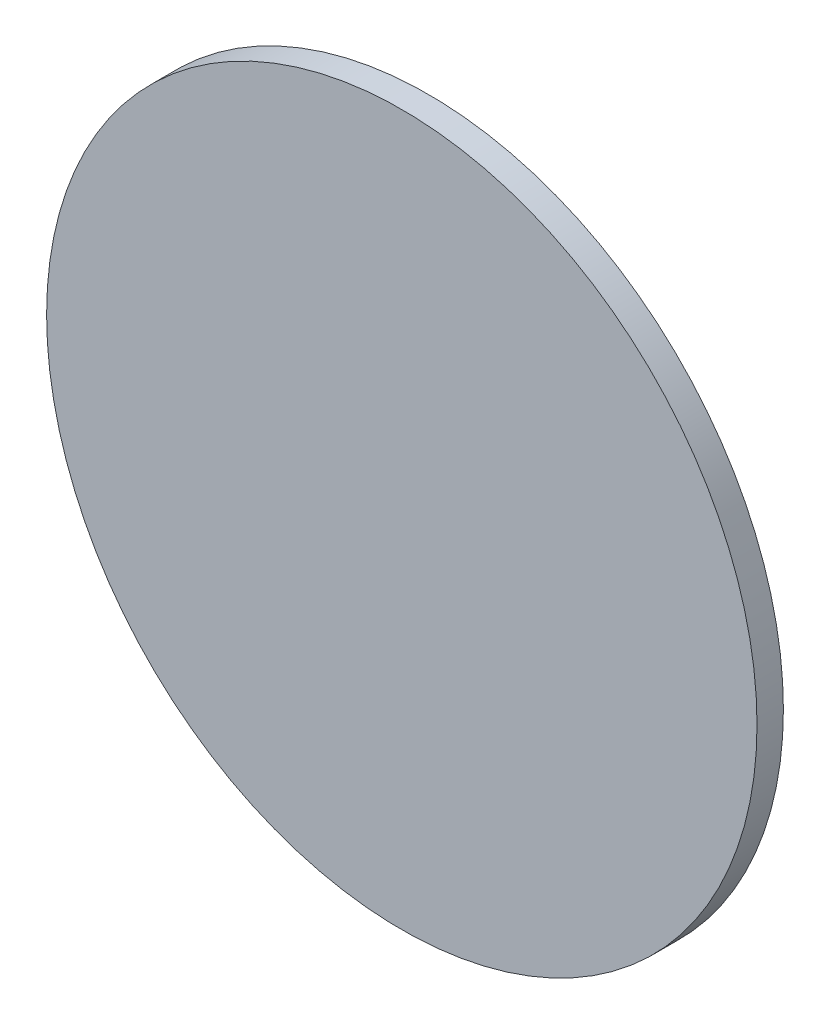
ISO-10303-21;
HEADER;
FILE_DESCRIPTION(('STEP AP214'),'2;1');
FILE_NAME('part.step','',(''),(''),'','','');
FILE_SCHEMA(('AUTOMOTIVE_DESIGN { 1 0 10303 214 1 1 1 1 }'));
ENDSEC;
DATA;
#1=APPLICATION_CONTEXT('core data for automotive mechanical design processes');
#2=APPLICATION_PROTOCOL_DEFINITION('international standard','automotive_design',2000,#1);
#3=PRODUCT_CONTEXT('',#1,'mechanical');
#4=PRODUCT('Part','Part','',(#3));
#5=PRODUCT_RELATED_PRODUCT_CATEGORY('part','',(#4));
#6=PRODUCT_DEFINITION_FORMATION('','',#4);
#7=PRODUCT_DEFINITION_CONTEXT('part definition',#1,'design');
#8=PRODUCT_DEFINITION('design','',#6,#7);
#9=PRODUCT_DEFINITION_SHAPE('','',#8);
#10=(LENGTH_UNIT() NAMED_UNIT(*) SI_UNIT(.MILLI.,.METRE.));
#11=(NAMED_UNIT(*) PLANE_ANGLE_UNIT() SI_UNIT($,.RADIAN.));
#12=(NAMED_UNIT(*) SI_UNIT($,.STERADIAN.) SOLID_ANGLE_UNIT());
#13=UNCERTAINTY_MEASURE_WITH_UNIT(LENGTH_MEASURE(1.E-05),#10,'distance_accuracy_value','');
#14=(GEOMETRIC_REPRESENTATION_CONTEXT(3) GLOBAL_UNCERTAINTY_ASSIGNED_CONTEXT((#13)) GLOBAL_UNIT_ASSIGNED_CONTEXT((#10,
#11,#12)) REPRESENTATION_CONTEXT('',''));
#15=CARTESIAN_POINT('',(0.,0.,0.));
#16=DIRECTION('',(0.,0.,1.));
#17=DIRECTION('',(1.,0.,0.));
#18=AXIS2_PLACEMENT_3D('',#15,#16,#17);
#19=CARTESIAN_POINT('',(0.,0.,1.5));
#20=DIRECTION('',(0.,0.,-1.));
#21=DIRECTION('',(-1.,0.,0.));
#22=AXIS2_PLACEMENT_3D('',#19,#20,#21);
#23=CYLINDRICAL_SURFACE('',#22,20.2);
#24=CARTESIAN_POINT('',(0.,0.,1.5));
#25=DIRECTION('',(0.,0.,1.));
#26=DIRECTION('',(1.,0.,0.));
#27=AXIS2_PLACEMENT_3D('',#24,#25,#26);
#28=CIRCLE('',#27,20.2);
#29=CARTESIAN_POINT('',(20.2,0.,1.5));
#30=VERTEX_POINT('',#29);
#31=EDGE_CURVE('E10',#30,#30,#28,.T.);
#32=ORIENTED_EDGE('',*,*,#31,.F.);
#33=EDGE_LOOP('',(#32));
#34=FACE_BOUND('',#33,.T.);
#35=CARTESIAN_POINT('',(0.,0.,0.));
#36=DIRECTION('',(0.,0.,1.));
#37=DIRECTION('',(1.,0.,0.));
#38=AXIS2_PLACEMENT_3D('',#35,#36,#37);
#39=CIRCLE('',#38,20.2);
#40=CARTESIAN_POINT('',(20.2,0.,0.));
#41=VERTEX_POINT('',#40);
#42=EDGE_CURVE('E41',#41,#41,#39,.T.);
#43=ORIENTED_EDGE('',*,*,#42,.T.);
#44=EDGE_LOOP('',(#43));
#45=FACE_BOUND('',#44,.T.);
#46=ADVANCED_FACE('F38',(#34,#45),#23,.T.);
#47=CARTESIAN_POINT('',(0.,0.,1.5));
#48=DIRECTION('',(0.,0.,1.));
#49=DIRECTION('',(1.,0.,0.));
#50=AXIS2_PLACEMENT_3D('',#47,#48,#49);
#51=PLANE('',#50);
#52=ORIENTED_EDGE('',*,*,#31,.T.);
#53=EDGE_LOOP('',(#52));
#54=FACE_BOUND('',#53,.T.);
#55=ADVANCED_FACE('F55',(#54),#51,.T.);
#56=CARTESIAN_POINT('',(0.,0.,0.));
#57=DIRECTION('',(0.,0.,1.));
#58=DIRECTION('',(1.,0.,0.));
#59=AXIS2_PLACEMENT_3D('',#56,#57,#58);
#60=PLANE('',#59);
#61=ORIENTED_EDGE('',*,*,#42,.F.);
#62=EDGE_LOOP('',(#61));
#63=FACE_BOUND('',#62,.T.);
#64=ADVANCED_FACE('F53',(#63),#60,.F.);
#65=CLOSED_SHELL('',(#46,#55,#64));
#66=MANIFOLD_SOLID_BREP('B2',#65);
#67=ADVANCED_BREP_SHAPE_REPRESENTATION('',(#18,#66),#14);
#68=SHAPE_DEFINITION_REPRESENTATION(#9,#67);
ENDSEC;
END-ISO-10303-21;
